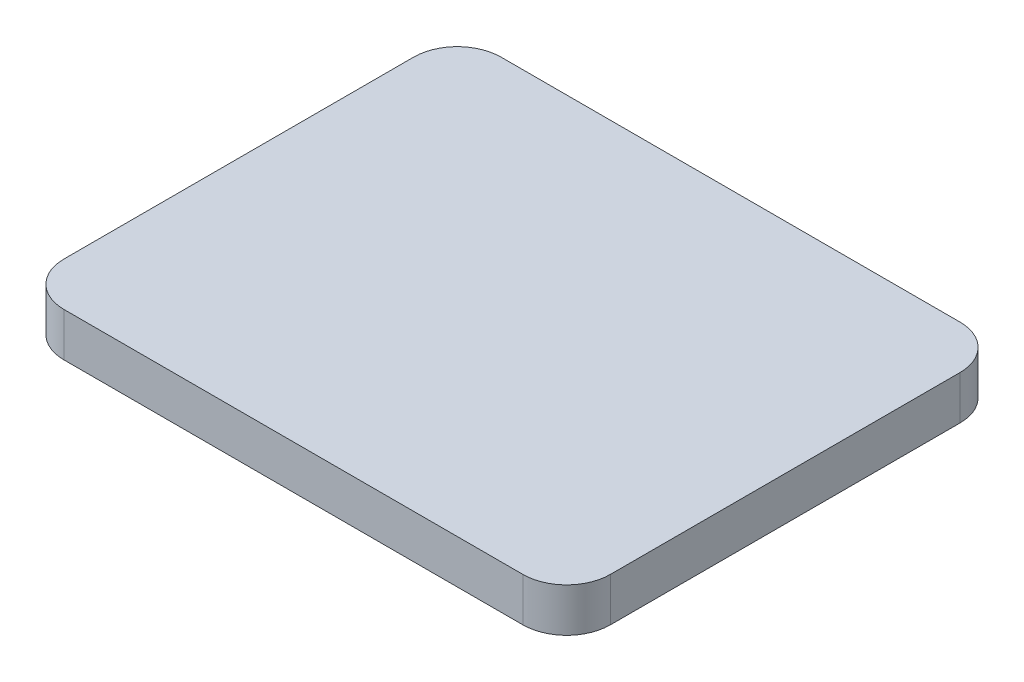
ISO-10303-21;
HEADER;
FILE_DESCRIPTION(('STEP AP214'),'2;1');
FILE_NAME('part.step','',(''),(''),'','','');
FILE_SCHEMA(('AUTOMOTIVE_DESIGN { 1 0 10303 214 1 1 1 1 }'));
ENDSEC;
DATA;
#1=APPLICATION_CONTEXT('core data for automotive mechanical design processes');
#2=APPLICATION_PROTOCOL_DEFINITION('international standard','automotive_design',2000,#1);
#3=PRODUCT_CONTEXT('',#1,'mechanical');
#4=PRODUCT('Part','Part','',(#3));
#5=PRODUCT_RELATED_PRODUCT_CATEGORY('part','',(#4));
#6=PRODUCT_DEFINITION_FORMATION('','',#4);
#7=PRODUCT_DEFINITION_CONTEXT('part definition',#1,'design');
#8=PRODUCT_DEFINITION('design','',#6,#7);
#9=PRODUCT_DEFINITION_SHAPE('','',#8);
#10=(LENGTH_UNIT() NAMED_UNIT(*) SI_UNIT(.MILLI.,.METRE.));
#11=(NAMED_UNIT(*) PLANE_ANGLE_UNIT() SI_UNIT($,.RADIAN.));
#12=(NAMED_UNIT(*) SI_UNIT($,.STERADIAN.) SOLID_ANGLE_UNIT());
#13=UNCERTAINTY_MEASURE_WITH_UNIT(LENGTH_MEASURE(1.E-05),#10,'distance_accuracy_value','');
#14=(GEOMETRIC_REPRESENTATION_CONTEXT(3) GLOBAL_UNCERTAINTY_ASSIGNED_CONTEXT((#13)) GLOBAL_UNIT_ASSIGNED_CONTEXT((#10,
#11,#12)) REPRESENTATION_CONTEXT('',''));
#15=CARTESIAN_POINT('',(0.,0.,0.));
#16=DIRECTION('',(0.,0.,1.));
#17=DIRECTION('',(1.,0.,0.));
#18=AXIS2_PLACEMENT_3D('',#15,#16,#17);
#19=CARTESIAN_POINT('',(-15.875,2.54,12.7));
#20=DIRECTION('',(1.,0.,0.));
#21=DIRECTION('',(0.,0.,-1.));
#22=AXIS2_PLACEMENT_3D('',#19,#20,#21);
#23=PLANE('',#22);
#24=DIRECTION('',(0.,0.,1.));
#25=VECTOR('',#24,1.);
#26=CARTESIAN_POINT('',(-15.875,2.54,12.7));
#27=LINE('',#26,#25);
#28=CARTESIAN_POINT('',(-15.875,2.54,-10.16));
#29=VERTEX_POINT('',#28);
#30=CARTESIAN_POINT('',(-15.875,2.54,10.16));
#31=VERTEX_POINT('',#30);
#32=EDGE_CURVE('E131',#29,#31,#27,.T.);
#33=ORIENTED_EDGE('',*,*,#32,.F.);
#34=DIRECTION('',(0.,-1.,0.));
#35=VECTOR('',#34,1.);
#36=CARTESIAN_POINT('',(-15.875,2.54,-10.16));
#37=LINE('',#36,#35);
#38=CARTESIAN_POINT('',(-15.875,0.,-10.16));
#39=VERTEX_POINT('',#38);
#40=EDGE_CURVE('E119',#29,#39,#37,.T.);
#41=ORIENTED_EDGE('',*,*,#40,.T.);
#42=DIRECTION('',(0.,0.,1.));
#43=VECTOR('',#42,1.);
#44=CARTESIAN_POINT('',(-15.875,0.,12.7));
#45=LINE('',#44,#43);
#46=CARTESIAN_POINT('',(-15.875,0.,10.16));
#47=VERTEX_POINT('',#46);
#48=EDGE_CURVE('E129',#39,#47,#45,.T.);
#49=ORIENTED_EDGE('',*,*,#48,.T.);
#50=DIRECTION('',(0.,-1.,0.));
#51=VECTOR('',#50,1.);
#52=CARTESIAN_POINT('',(-15.875,2.54,10.16));
#53=LINE('',#52,#51);
#54=EDGE_CURVE('E132',#47,#31,#53,.F.);
#55=ORIENTED_EDGE('',*,*,#54,.T.);
#56=EDGE_LOOP('',(#33,#41,#49,#55));
#57=FACE_BOUND('',#56,.T.);
#58=ADVANCED_FACE('F44',(#57),#23,.F.);
#59=CARTESIAN_POINT('',(-15.875,2.54,12.7));
#60=DIRECTION('',(0.,0.,-1.));
#61=DIRECTION('',(-1.,0.,0.));
#62=AXIS2_PLACEMENT_3D('',#59,#60,#61);
#63=PLANE('',#62);
#64=DIRECTION('',(1.,0.,0.));
#65=VECTOR('',#64,1.);
#66=CARTESIAN_POINT('',(-15.875,0.,12.7));
#67=LINE('',#66,#65);
#68=CARTESIAN_POINT('',(-13.335,0.,12.7));
#69=VERTEX_POINT('',#68);
#70=CARTESIAN_POINT('',(13.335,0.,12.7));
#71=VERTEX_POINT('',#70);
#72=EDGE_CURVE('E139',#69,#71,#67,.T.);
#73=ORIENTED_EDGE('',*,*,#72,.T.);
#74=DIRECTION('',(0.,-1.,0.));
#75=VECTOR('',#74,1.);
#76=CARTESIAN_POINT('',(13.335,2.54,12.7));
#77=LINE('',#76,#75);
#78=CARTESIAN_POINT('',(13.335,2.54,12.7));
#79=VERTEX_POINT('',#78);
#80=EDGE_CURVE('E11',#71,#79,#77,.F.);
#81=ORIENTED_EDGE('',*,*,#80,.T.);
#82=DIRECTION('',(1.,0.,0.));
#83=VECTOR('',#82,1.);
#84=CARTESIAN_POINT('',(-15.875,2.54,12.7));
#85=LINE('',#84,#83);
#86=CARTESIAN_POINT('',(-13.335,2.54,12.7));
#87=VERTEX_POINT('',#86);
#88=EDGE_CURVE('E195',#87,#79,#85,.T.);
#89=ORIENTED_EDGE('',*,*,#88,.F.);
#90=DIRECTION('',(0.,-1.,0.));
#91=VECTOR('',#90,1.);
#92=CARTESIAN_POINT('',(-13.335,2.54,12.7));
#93=LINE('',#92,#91);
#94=EDGE_CURVE('E53',#87,#69,#93,.T.);
#95=ORIENTED_EDGE('',*,*,#94,.T.);
#96=EDGE_LOOP('',(#73,#81,#89,#95));
#97=FACE_BOUND('',#96,.T.);
#98=ADVANCED_FACE('F187',(#97),#63,.F.);
#99=CARTESIAN_POINT('',(15.875,2.54,12.7));
#100=DIRECTION('',(-1.,0.,0.));
#101=DIRECTION('',(0.,0.,1.));
#102=AXIS2_PLACEMENT_3D('',#99,#100,#101);
#103=PLANE('',#102);
#104=DIRECTION('',(0.,0.,-1.));
#105=VECTOR('',#104,1.);
#106=CARTESIAN_POINT('',(15.875,0.,12.7));
#107=LINE('',#106,#105);
#108=CARTESIAN_POINT('',(15.875,0.,10.16));
#109=VERTEX_POINT('',#108);
#110=CARTESIAN_POINT('',(15.875,0.,-10.16));
#111=VERTEX_POINT('',#110);
#112=EDGE_CURVE('E145',#109,#111,#107,.T.);
#113=ORIENTED_EDGE('',*,*,#112,.T.);
#114=DIRECTION('',(0.,-1.,0.));
#115=VECTOR('',#114,1.);
#116=CARTESIAN_POINT('',(15.875,2.54,-10.16));
#117=LINE('',#116,#115);
#118=CARTESIAN_POINT('',(15.875,2.54,-10.16));
#119=VERTEX_POINT('',#118);
#120=EDGE_CURVE('E64',#111,#119,#117,.F.);
#121=ORIENTED_EDGE('',*,*,#120,.T.);
#122=DIRECTION('',(0.,0.,-1.));
#123=VECTOR('',#122,1.);
#124=CARTESIAN_POINT('',(15.875,2.54,12.7));
#125=LINE('',#124,#123);
#126=CARTESIAN_POINT('',(15.875,2.54,10.16));
#127=VERTEX_POINT('',#126);
#128=EDGE_CURVE('E199',#127,#119,#125,.T.);
#129=ORIENTED_EDGE('',*,*,#128,.F.);
#130=DIRECTION('',(0.,-1.,0.));
#131=VECTOR('',#130,1.);
#132=CARTESIAN_POINT('',(15.875,2.54,10.16));
#133=LINE('',#132,#131);
#134=EDGE_CURVE('E179',#127,#109,#133,.T.);
#135=ORIENTED_EDGE('',*,*,#134,.T.);
#136=EDGE_LOOP('',(#113,#121,#129,#135));
#137=FACE_BOUND('',#136,.T.);
#138=ADVANCED_FACE('F200',(#137),#103,.F.);
#139=CARTESIAN_POINT('',(-15.875,2.54,-12.7));
#140=DIRECTION('',(0.,0.,1.));
#141=DIRECTION('',(1.,0.,0.));
#142=AXIS2_PLACEMENT_3D('',#139,#140,#141);
#143=PLANE('',#142);
#144=DIRECTION('',(-1.,0.,0.));
#145=VECTOR('',#144,1.);
#146=CARTESIAN_POINT('',(-15.875,0.,-12.7));
#147=LINE('',#146,#145);
#148=CARTESIAN_POINT('',(13.335,0.,-12.7));
#149=VERTEX_POINT('',#148);
#150=CARTESIAN_POINT('',(-13.335,0.,-12.7));
#151=VERTEX_POINT('',#150);
#152=EDGE_CURVE('E155',#149,#151,#147,.T.);
#153=ORIENTED_EDGE('',*,*,#152,.T.);
#154=DIRECTION('',(0.,-1.,0.));
#155=VECTOR('',#154,1.);
#156=CARTESIAN_POINT('',(-13.335,2.54,-12.7));
#157=LINE('',#156,#155);
#158=CARTESIAN_POINT('',(-13.335,2.54,-12.7));
#159=VERTEX_POINT('',#158);
#160=EDGE_CURVE('E116',#151,#159,#157,.F.);
#161=ORIENTED_EDGE('',*,*,#160,.T.);
#162=DIRECTION('',(-1.,0.,0.));
#163=VECTOR('',#162,1.);
#164=CARTESIAN_POINT('',(-15.875,2.54,-12.7));
#165=LINE('',#164,#163);
#166=CARTESIAN_POINT('',(13.335,2.54,-12.7));
#167=VERTEX_POINT('',#166);
#168=EDGE_CURVE('E150',#167,#159,#165,.T.);
#169=ORIENTED_EDGE('',*,*,#168,.F.);
#170=DIRECTION('',(0.,-1.,0.));
#171=VECTOR('',#170,1.);
#172=CARTESIAN_POINT('',(13.335,2.54,-12.7));
#173=LINE('',#172,#171);
#174=EDGE_CURVE('E123',#167,#149,#173,.T.);
#175=ORIENTED_EDGE('',*,*,#174,.T.);
#176=EDGE_LOOP('',(#153,#161,#169,#175));
#177=FACE_BOUND('',#176,.T.);
#178=ADVANCED_FACE('F235',(#177),#143,.F.);
#179=CARTESIAN_POINT('',(0.,2.54,0.));
#180=DIRECTION('',(0.,-1.,0.));
#181=DIRECTION('',(0.,0.,-1.));
#182=AXIS2_PLACEMENT_3D('',#179,#180,#181);
#183=PLANE('',#182);
#184=ORIENTED_EDGE('',*,*,#168,.T.);
#185=CARTESIAN_POINT('',(-13.335,2.54,-10.16));
#186=DIRECTION('',(0.,-1.,0.));
#187=DIRECTION('',(0.,0.,-1.));
#188=AXIS2_PLACEMENT_3D('',#185,#186,#187);
#189=CIRCLE('',#188,2.54);
#190=EDGE_CURVE('E180',#159,#29,#189,.F.);
#191=ORIENTED_EDGE('',*,*,#190,.T.);
#192=ORIENTED_EDGE('',*,*,#32,.T.);
#193=CARTESIAN_POINT('',(-13.335,2.54,10.16));
#194=DIRECTION('',(0.,-1.,0.));
#195=DIRECTION('',(0.,0.,-1.));
#196=AXIS2_PLACEMENT_3D('',#193,#194,#195);
#197=CIRCLE('',#196,2.54);
#198=EDGE_CURVE('E166',#31,#87,#197,.F.);
#199=ORIENTED_EDGE('',*,*,#198,.T.);
#200=ORIENTED_EDGE('',*,*,#88,.T.);
#201=CARTESIAN_POINT('',(13.335,2.54,10.16));
#202=DIRECTION('',(0.,-1.,0.));
#203=DIRECTION('',(0.,0.,-1.));
#204=AXIS2_PLACEMENT_3D('',#201,#202,#203);
#205=CIRCLE('',#204,2.54);
#206=EDGE_CURVE('E68',#79,#127,#205,.F.);
#207=ORIENTED_EDGE('',*,*,#206,.T.);
#208=ORIENTED_EDGE('',*,*,#128,.T.);
#209=CARTESIAN_POINT('',(13.335,2.54,-10.16));
#210=DIRECTION('',(0.,-1.,0.));
#211=DIRECTION('',(0.,0.,-1.));
#212=AXIS2_PLACEMENT_3D('',#209,#210,#211);
#213=CIRCLE('',#212,2.54);
#214=EDGE_CURVE('E173',#119,#167,#213,.F.);
#215=ORIENTED_EDGE('',*,*,#214,.T.);
#216=EDGE_LOOP('',(#184,#191,#192,#199,#200,#207,#208,#215));
#217=FACE_BOUND('',#216,.T.);
#218=ADVANCED_FACE('F207',(#217),#183,.F.);
#219=CARTESIAN_POINT('',(0.,0.,0.));
#220=DIRECTION('',(0.,-1.,0.));
#221=DIRECTION('',(0.,0.,-1.));
#222=AXIS2_PLACEMENT_3D('',#219,#220,#221);
#223=PLANE('',#222);
#224=ORIENTED_EDGE('',*,*,#48,.F.);
#225=CARTESIAN_POINT('',(-13.335,0.,-10.16));
#226=DIRECTION('',(0.,-1.,0.));
#227=DIRECTION('',(0.,0.,-1.));
#228=AXIS2_PLACEMENT_3D('',#225,#226,#227);
#229=CIRCLE('',#228,2.54);
#230=EDGE_CURVE('E115',#39,#151,#229,.T.);
#231=ORIENTED_EDGE('',*,*,#230,.T.);
#232=ORIENTED_EDGE('',*,*,#152,.F.);
#233=CARTESIAN_POINT('',(13.335,0.,-10.16));
#234=DIRECTION('',(0.,-1.,0.));
#235=DIRECTION('',(0.,0.,-1.));
#236=AXIS2_PLACEMENT_3D('',#233,#234,#235);
#237=CIRCLE('',#236,2.54);
#238=EDGE_CURVE('E122',#149,#111,#237,.T.);
#239=ORIENTED_EDGE('',*,*,#238,.T.);
#240=ORIENTED_EDGE('',*,*,#112,.F.);
#241=CARTESIAN_POINT('',(13.335,0.,10.16));
#242=DIRECTION('',(0.,-1.,0.));
#243=DIRECTION('',(0.,0.,-1.));
#244=AXIS2_PLACEMENT_3D('',#241,#242,#243);
#245=CIRCLE('',#244,2.54);
#246=EDGE_CURVE('E157',#109,#71,#245,.T.);
#247=ORIENTED_EDGE('',*,*,#246,.T.);
#248=ORIENTED_EDGE('',*,*,#72,.F.);
#249=CARTESIAN_POINT('',(-13.335,0.,10.16));
#250=DIRECTION('',(0.,-1.,0.));
#251=DIRECTION('',(0.,0.,-1.));
#252=AXIS2_PLACEMENT_3D('',#249,#250,#251);
#253=CIRCLE('',#252,2.54);
#254=EDGE_CURVE('E133',#69,#47,#253,.T.);
#255=ORIENTED_EDGE('',*,*,#254,.T.);
#256=EDGE_LOOP('',(#224,#231,#232,#239,#240,#247,#248,#255));
#257=FACE_BOUND('',#256,.T.);
#258=ADVANCED_FACE('F140',(#257),#223,.T.);
#259=CARTESIAN_POINT('',(-13.335,2.54,-10.16));
#260=DIRECTION('',(0.,-1.,0.));
#261=DIRECTION('',(0.,0.,-1.));
#262=AXIS2_PLACEMENT_3D('',#259,#260,#261);
#263=CYLINDRICAL_SURFACE('',#262,2.54);
#264=ORIENTED_EDGE('',*,*,#190,.F.);
#265=ORIENTED_EDGE('',*,*,#160,.F.);
#266=ORIENTED_EDGE('',*,*,#230,.F.);
#267=ORIENTED_EDGE('',*,*,#40,.F.);
#268=EDGE_LOOP('',(#264,#265,#266,#267));
#269=FACE_BOUND('',#268,.T.);
#270=ADVANCED_FACE('F113',(#269),#263,.T.);
#271=CARTESIAN_POINT('',(13.335,2.54,-10.16));
#272=DIRECTION('',(0.,-1.,0.));
#273=DIRECTION('',(0.,0.,-1.));
#274=AXIS2_PLACEMENT_3D('',#271,#272,#273);
#275=CYLINDRICAL_SURFACE('',#274,2.54);
#276=ORIENTED_EDGE('',*,*,#214,.F.);
#277=ORIENTED_EDGE('',*,*,#120,.F.);
#278=ORIENTED_EDGE('',*,*,#238,.F.);
#279=ORIENTED_EDGE('',*,*,#174,.F.);
#280=EDGE_LOOP('',(#276,#277,#278,#279));
#281=FACE_BOUND('',#280,.T.);
#282=ADVANCED_FACE('F212',(#281),#275,.T.);
#283=CARTESIAN_POINT('',(13.335,2.54,10.16));
#284=DIRECTION('',(0.,-1.,0.));
#285=DIRECTION('',(0.,0.,-1.));
#286=AXIS2_PLACEMENT_3D('',#283,#284,#285);
#287=CYLINDRICAL_SURFACE('',#286,2.54);
#288=ORIENTED_EDGE('',*,*,#206,.F.);
#289=ORIENTED_EDGE('',*,*,#80,.F.);
#290=ORIENTED_EDGE('',*,*,#246,.F.);
#291=ORIENTED_EDGE('',*,*,#134,.F.);
#292=EDGE_LOOP('',(#288,#289,#290,#291));
#293=FACE_BOUND('',#292,.T.);
#294=ADVANCED_FACE('F196',(#293),#287,.T.);
#295=CARTESIAN_POINT('',(-13.335,2.54,10.16));
#296=DIRECTION('',(0.,-1.,0.));
#297=DIRECTION('',(0.,0.,-1.));
#298=AXIS2_PLACEMENT_3D('',#295,#296,#297);
#299=CYLINDRICAL_SURFACE('',#298,2.54);
#300=ORIENTED_EDGE('',*,*,#198,.F.);
#301=ORIENTED_EDGE('',*,*,#54,.F.);
#302=ORIENTED_EDGE('',*,*,#254,.F.);
#303=ORIENTED_EDGE('',*,*,#94,.F.);
#304=EDGE_LOOP('',(#300,#301,#302,#303));
#305=FACE_BOUND('',#304,.T.);
#306=ADVANCED_FACE('F50',(#305),#299,.T.);
#307=CLOSED_SHELL('',(#58,#98,#138,#178,#218,#258,#270,#282,#294,#306));
#308=MANIFOLD_SOLID_BREP('B2',#307);
#309=ADVANCED_BREP_SHAPE_REPRESENTATION('',(#18,#308),#14);
#310=SHAPE_DEFINITION_REPRESENTATION(#9,#309);
ENDSEC;
END-ISO-10303-21;
